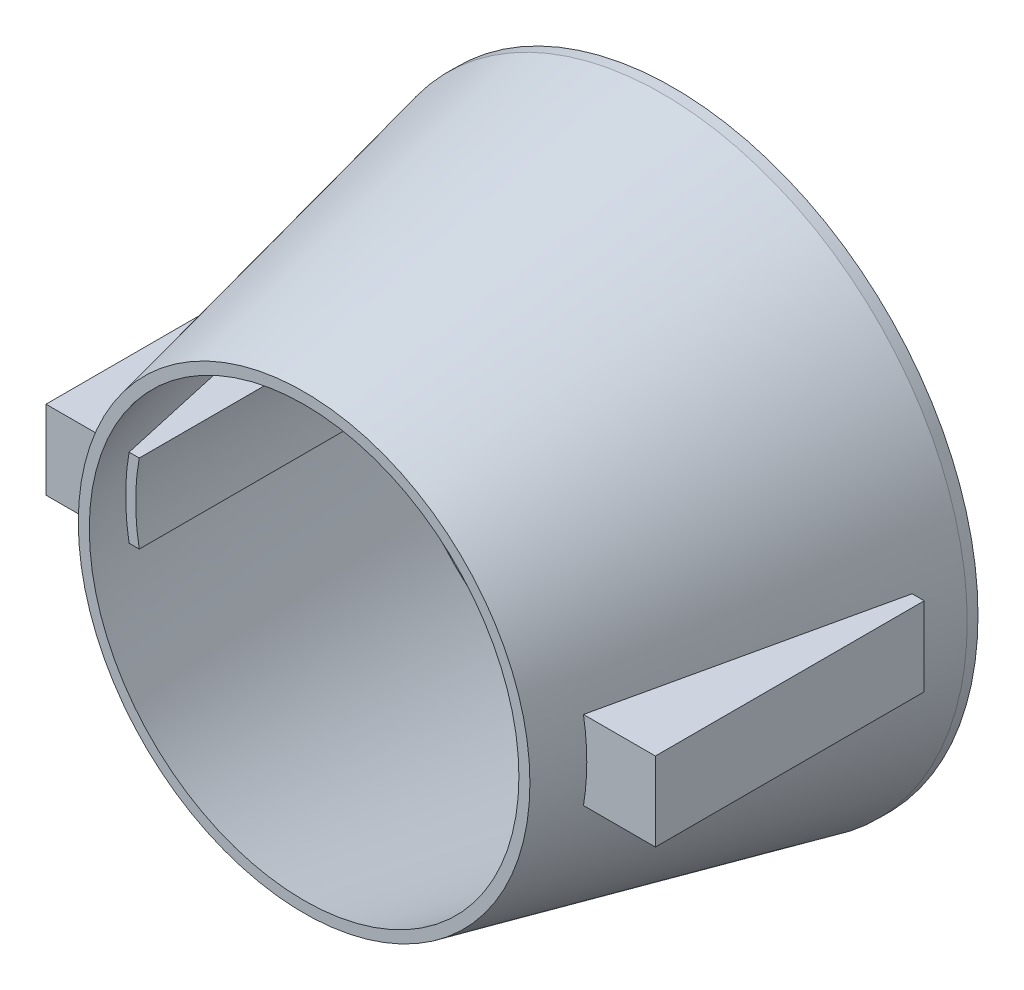
ISO-10303-21;
HEADER;
FILE_DESCRIPTION(('STEP AP214'),'2;1');
FILE_NAME('part.step','',(''),(''),'','','');
FILE_SCHEMA(('AUTOMOTIVE_DESIGN { 1 0 10303 214 1 1 1 1 }'));
ENDSEC;
DATA;
#1=APPLICATION_CONTEXT('core data for automotive mechanical design processes');
#2=APPLICATION_PROTOCOL_DEFINITION('international standard','automotive_design',2000,#1);
#3=PRODUCT_CONTEXT('',#1,'mechanical');
#4=PRODUCT('Part','Part','',(#3));
#5=PRODUCT_RELATED_PRODUCT_CATEGORY('part','',(#4));
#6=PRODUCT_DEFINITION_FORMATION('','',#4);
#7=PRODUCT_DEFINITION_CONTEXT('part definition',#1,'design');
#8=PRODUCT_DEFINITION('design','',#6,#7);
#9=PRODUCT_DEFINITION_SHAPE('','',#8);
#10=(LENGTH_UNIT() NAMED_UNIT(*) SI_UNIT(.MILLI.,.METRE.));
#11=(NAMED_UNIT(*) PLANE_ANGLE_UNIT() SI_UNIT($,.RADIAN.));
#12=(NAMED_UNIT(*) SI_UNIT($,.STERADIAN.) SOLID_ANGLE_UNIT());
#13=UNCERTAINTY_MEASURE_WITH_UNIT(LENGTH_MEASURE(1.E-05),#10,'distance_accuracy_value','');
#14=(GEOMETRIC_REPRESENTATION_CONTEXT(3) GLOBAL_UNCERTAINTY_ASSIGNED_CONTEXT((#13)) GLOBAL_UNIT_ASSIGNED_CONTEXT((#10,
#11,#12)) REPRESENTATION_CONTEXT('',''));
#15=CARTESIAN_POINT('',(0.,0.,0.));
#16=DIRECTION('',(0.,0.,1.));
#17=DIRECTION('',(1.,0.,0.));
#18=AXIS2_PLACEMENT_3D('',#15,#16,#17);
#19=CARTESIAN_POINT('',(0.,-11.,15.));
#20=DIRECTION('',(0.,0.,-1.));
#21=DIRECTION('',(0.,-1.,0.));
#22=AXIS2_PLACEMENT_3D('',#19,#20,#21);
#23=PLANE('',#22);
#24=CARTESIAN_POINT('',(0.,0.,15.));
#25=DIRECTION('',(0.,0.,1.));
#26=DIRECTION('',(-1.,0.,0.));
#27=AXIS2_PLACEMENT_3D('',#24,#25,#26);
#28=CIRCLE('',#27,60.);
#29=CARTESIAN_POINT('',(-58.9830484122345,11.,15.));
#30=VERTEX_POINT('',#29);
#31=CARTESIAN_POINT('',(-58.9830484122345,-11.,15.));
#32=VERTEX_POINT('',#31);
#33=EDGE_CURVE('E636',#30,#32,#28,.T.);
#34=ORIENTED_EDGE('',*,*,#33,.T.);
#35=DIRECTION('',(-1.,0.,0.));
#36=VECTOR('',#35,1.);
#37=CARTESIAN_POINT('',(0.,-11.,15.));
#38=LINE('',#37,#36);
#39=CARTESIAN_POINT('',(-78.5215118846876,-11.,15.));
#40=VERTEX_POINT('',#39);
#41=EDGE_CURVE('E639',#32,#40,#38,.T.);
#42=ORIENTED_EDGE('',*,*,#41,.T.);
#43=CARTESIAN_POINT('',(0.,0.,15.));
#44=DIRECTION('',(0.,0.,1.));
#45=DIRECTION('',(-1.,0.,0.));
#46=AXIS2_PLACEMENT_3D('',#43,#44,#45);
#47=CIRCLE('',#46,79.2882578233191);
#48=CARTESIAN_POINT('',(-78.5215118846876,11.,15.));
#49=VERTEX_POINT('',#48);
#50=EDGE_CURVE('E338',#49,#40,#47,.T.);
#51=ORIENTED_EDGE('',*,*,#50,.F.);
#52=DIRECTION('',(1.,0.,0.));
#53=VECTOR('',#52,1.);
#54=CARTESIAN_POINT('',(0.,11.,15.));
#55=LINE('',#54,#53);
#56=EDGE_CURVE('E11',#49,#30,#55,.T.);
#57=ORIENTED_EDGE('',*,*,#56,.T.);
#58=EDGE_LOOP('',(#34,#42,#51,#57));
#59=FACE_BOUND('',#58,.T.);
#60=ADVANCED_FACE('F17',(#59),#23,.T.);
#61=CARTESIAN_POINT('',(0.,11.,15.));
#62=DIRECTION('',(0.,1.,0.));
#63=DIRECTION('',(1.,0.,0.));
#64=AXIS2_PLACEMENT_3D('',#61,#62,#63);
#65=PLANE('',#64);
#66=DIRECTION('',(0.,0.,-1.));
#67=VECTOR('',#66,1.);
#68=CARTESIAN_POINT('',(-58.9830484122345,11.,90.));
#69=LINE('',#68,#67);
#70=CARTESIAN_POINT('',(-58.9830484122345,11.,90.));
#71=VERTEX_POINT('',#70);
#72=EDGE_CURVE('E644',#71,#30,#69,.T.);
#73=ORIENTED_EDGE('',*,*,#72,.T.);
#74=ORIENTED_EDGE('',*,*,#56,.F.);
#75=CARTESIAN_POINT('',(-61.8171927580637,11.,90.));
#76=CARTESIAN_POINT('',(-69.1993775707195,11.,56.9635723910746));
#77=CARTESIAN_POINT('',(-78.5215118846876,11.,15.));
#78=(BOUNDED_CURVE() B_SPLINE_CURVE(2,(#75,#76,#77),.UNSPECIFIED.,.F.,
.F.) B_SPLINE_CURVE_WITH_KNOTS((3,3),(0.,7.68377175610761),
.UNSPECIFIED.) CURVE() GEOMETRIC_REPRESENTATION_ITEM() RATIONAL_B_SPLINE_CURVE((1.,
1.00698416186936,1.)) REPRESENTATION_ITEM(''));
#79=CARTESIAN_POINT('',(-61.8171927580637,11.,90.));
#80=VERTEX_POINT('',#79);
#81=EDGE_CURVE('E332',#80,#49,#78,.T.);
#82=ORIENTED_EDGE('',*,*,#81,.F.);
#83=DIRECTION('',(1.,0.,0.));
#84=VECTOR('',#83,1.);
#85=CARTESIAN_POINT('',(0.,11.,90.));
#86=LINE('',#85,#84);
#87=EDGE_CURVE('E731',#80,#71,#86,.T.);
#88=ORIENTED_EDGE('',*,*,#87,.T.);
#89=EDGE_LOOP('',(#73,#74,#82,#88));
#90=FACE_BOUND('',#89,.T.);
#91=ADVANCED_FACE('F584',(#90),#65,.T.);
#92=CARTESIAN_POINT('',(0.,0.,0.));
#93=DIRECTION('',(0.,0.,1.));
#94=DIRECTION('',(1.,0.,0.));
#95=AXIS2_PLACEMENT_3D('',#92,#93,#94);
#96=PLANE('',#95);
#97=CARTESIAN_POINT('',(0.,0.,0.));
#98=DIRECTION('',(0.,0.,-1.));
#99=DIRECTION('',(1.,0.,0.));
#100=AXIS2_PLACEMENT_3D('',#97,#98,#99);
#101=CIRCLE('',#100,60.);
#102=CARTESIAN_POINT('',(-60.,0.,0.));
#103=VERTEX_POINT('',#102);
#104=EDGE_CURVE('E46',#103,#103,#101,.T.);
#105=ORIENTED_EDGE('',*,*,#104,.F.);
#106=EDGE_LOOP('',(#105));
#107=FACE_BOUND('',#106,.T.);
#108=CARTESIAN_POINT('',(0.,0.,0.));
#109=DIRECTION('',(0.,0.,1.));
#110=DIRECTION('',(1.,0.,0.));
#111=AXIS2_PLACEMENT_3D('',#108,#109,#110);
#112=CIRCLE('',#111,85.);
#113=CARTESIAN_POINT('',(-85.,0.,0.));
#114=VERTEX_POINT('',#113);
#115=EDGE_CURVE('E20',#114,#114,#112,.T.);
#116=ORIENTED_EDGE('',*,*,#115,.F.);
#117=EDGE_LOOP('',(#116));
#118=FACE_BOUND('',#117,.T.);
#119=ADVANCED_FACE('F519',(#107,#118),#96,.F.);
#120=CARTESIAN_POINT('',(0.,0.,0.));
#121=DIRECTION('',(0.,0.,1.));
#122=DIRECTION('',(1.,0.,0.));
#123=AXIS2_PLACEMENT_3D('',#120,#121,#122);
#124=CYLINDRICAL_SURFACE('',#123,85.);
#125=CARTESIAN_POINT('',(0.,0.,3.));
#126=DIRECTION('',(0.,0.,1.));
#127=DIRECTION('',(1.,0.,0.));
#128=AXIS2_PLACEMENT_3D('',#125,#126,#127);
#129=CIRCLE('',#128,85.);
#130=CARTESIAN_POINT('',(-85.,0.,3.));
#131=VERTEX_POINT('',#130);
#132=CARTESIAN_POINT('',(85.,0.,3.));
#133=VERTEX_POINT('',#132);
#134=EDGE_CURVE('E303',#131,#133,#129,.T.);
#135=ORIENTED_EDGE('',*,*,#134,.F.);
#136=DIRECTION('',(0.,0.,-1.));
#137=VECTOR('',#136,1.);
#138=CARTESIAN_POINT('',(-85.,0.,0.));
#139=LINE('',#138,#137);
#140=EDGE_CURVE('E361',#131,#114,#139,.T.);
#141=ORIENTED_EDGE('',*,*,#140,.T.);
#142=ORIENTED_EDGE('',*,*,#115,.T.);
#143=ORIENTED_EDGE('',*,*,#140,.F.);
#144=CARTESIAN_POINT('',(0.,0.,3.));
#145=DIRECTION('',(0.,0.,1.));
#146=DIRECTION('',(1.,0.,0.));
#147=AXIS2_PLACEMENT_3D('',#144,#145,#146);
#148=CIRCLE('',#147,85.);
#149=EDGE_CURVE('E307',#133,#131,#148,.T.);
#150=ORIENTED_EDGE('',*,*,#149,.F.);
#151=EDGE_LOOP('',(#135,#141,#142,#143,#150));
#152=FACE_BOUND('',#151,.T.);
#153=ADVANCED_FACE('F513',(#152),#124,.T.);
#154=CARTESIAN_POINT('',(0.,0.,0.));
#155=DIRECTION('',(0.,0.,1.));
#156=DIRECTION('',(1.,0.,0.));
#157=AXIS2_PLACEMENT_3D('',#154,#155,#156);
#158=CYLINDRICAL_SURFACE('',#157,60.);
#159=CARTESIAN_POINT('',(0.,0.,3.));
#160=DIRECTION('',(0.,0.,-1.));
#161=DIRECTION('',(1.,0.,0.));
#162=AXIS2_PLACEMENT_3D('',#159,#160,#161);
#163=CIRCLE('',#162,60.);
#164=CARTESIAN_POINT('',(-60.,0.,3.));
#165=VERTEX_POINT('',#164);
#166=EDGE_CURVE('E297',#165,#165,#163,.T.);
#167=ORIENTED_EDGE('',*,*,#166,.F.);
#168=DIRECTION('',(0.,0.,-1.));
#169=VECTOR('',#168,1.);
#170=CARTESIAN_POINT('',(-60.,0.,0.));
#171=LINE('',#170,#169);
#172=EDGE_CURVE('E306',#165,#103,#171,.T.);
#173=ORIENTED_EDGE('',*,*,#172,.T.);
#174=ORIENTED_EDGE('',*,*,#104,.T.);
#175=ORIENTED_EDGE('',*,*,#172,.F.);
#176=EDGE_LOOP('',(#167,#173,#174,#175));
#177=FACE_BOUND('',#176,.T.);
#178=ADVANCED_FACE('F518',(#177),#158,.F.);
#179=CARTESIAN_POINT('',(0.,0.,3.));
#180=DIRECTION('',(0.,0.,-1.));
#181=DIRECTION('',(-1.,0.,0.));
#182=AXIS2_PLACEMENT_3D('',#179,#180,#181);
#183=CONICAL_SURFACE('',#182,85.,0.216550304976089);
#184=CARTESIAN_POINT('',(-64.9348873872897,-11.,90.));
#185=CARTESIAN_POINT('',(-72.3496815282606,-11.,56.7698132026675));
#186=CARTESIAN_POINT('',(-81.6221146503814,-11.,15.));
#187=(BOUNDED_CURVE() B_SPLINE_CURVE(2,(#184,#185,#186),.UNSPECIFIED.,.F.,
.F.) B_SPLINE_CURVE_WITH_KNOTS((3,3),(0.,7.68340027985582),
.UNSPECIFIED.) CURVE() GEOMETRIC_REPRESENTATION_ITEM() RATIONAL_B_SPLINE_CURVE((1.,
1.00639849012095,1.)) REPRESENTATION_ITEM(''));
#188=CARTESIAN_POINT('',(-64.9348873872897,-11.,90.));
#189=VERTEX_POINT('',#188);
#190=CARTESIAN_POINT('',(-81.6221146503814,-11.,15.));
#191=VERTEX_POINT('',#190);
#192=EDGE_CURVE('E743',#189,#191,#187,.T.);
#193=ORIENTED_EDGE('',*,*,#192,.T.);
#194=CARTESIAN_POINT('',(0.,0.,15.));
#195=DIRECTION('',(0.,0.,-1.));
#196=DIRECTION('',(-1.,0.,0.));
#197=AXIS2_PLACEMENT_3D('',#194,#195,#196);
#198=CIRCLE('',#197,82.36);
#199=CARTESIAN_POINT('',(-81.6221146503814,11.,15.));
#200=VERTEX_POINT('',#199);
#201=EDGE_CURVE('E279',#191,#200,#198,.T.);
#202=ORIENTED_EDGE('',*,*,#201,.T.);
#203=CARTESIAN_POINT('',(-81.6221146503814,11.,15.));
#204=CARTESIAN_POINT('',(-72.3496815282606,11.,56.7698132026675));
#205=CARTESIAN_POINT('',(-64.9348873872897,11.,90.));
#206=(BOUNDED_CURVE() B_SPLINE_CURVE(2,(#203,#204,#205),.UNSPECIFIED.,.F.,
.F.) B_SPLINE_CURVE_WITH_KNOTS((3,3),(0.,7.68340027985582),
.UNSPECIFIED.) CURVE() GEOMETRIC_REPRESENTATION_ITEM() RATIONAL_B_SPLINE_CURVE((1.,
1.00639849012095,1.)) REPRESENTATION_ITEM(''));
#207=CARTESIAN_POINT('',(-64.9348873872897,11.,90.));
#208=VERTEX_POINT('',#207);
#209=EDGE_CURVE('E302',#200,#208,#206,.T.);
#210=ORIENTED_EDGE('',*,*,#209,.T.);
#211=CARTESIAN_POINT('',(0.,0.,90.));
#212=DIRECTION('',(0.,0.,1.));
#213=DIRECTION('',(-1.,0.,0.));
#214=AXIS2_PLACEMENT_3D('',#211,#212,#213);
#215=CIRCLE('',#214,65.86);
#216=EDGE_CURVE('E270',#208,#189,#215,.T.);
#217=ORIENTED_EDGE('',*,*,#216,.T.);
#218=EDGE_LOOP('',(#193,#202,#210,#217));
#219=FACE_BOUND('',#218,.T.);
#220=CARTESIAN_POINT('',(0.,0.,103.));
#221=DIRECTION('',(0.,0.,-1.));
#222=DIRECTION('',(1.,0.,0.));
#223=AXIS2_PLACEMENT_3D('',#220,#221,#222);
#224=CIRCLE('',#223,63.);
#225=CARTESIAN_POINT('',(63.,0.,103.));
#226=VERTEX_POINT('',#225);
#227=EDGE_CURVE('E346',#226,#226,#224,.T.);
#228=ORIENTED_EDGE('',*,*,#227,.T.);
#229=DIRECTION('',(0.21486178267512,0.,-0.97664446670509));
#230=VECTOR('',#229,1.);
#231=CARTESIAN_POINT('',(85.,0.,3.));
#232=LINE('',#231,#230);
#233=CARTESIAN_POINT('',(65.86,0.,90.));
#234=VERTEX_POINT('',#233);
#235=EDGE_CURVE('E350',#226,#234,#232,.T.);
#236=ORIENTED_EDGE('',*,*,#235,.T.);
#237=CARTESIAN_POINT('',(0.,0.,90.));
#238=DIRECTION('',(0.,0.,1.));
#239=DIRECTION('',(-1.,0.,0.));
#240=AXIS2_PLACEMENT_3D('',#237,#238,#239);
#241=CIRCLE('',#240,65.86);
#242=CARTESIAN_POINT('',(64.9348873872897,11.,90.));
#243=VERTEX_POINT('',#242);
#244=EDGE_CURVE('E266',#234,#243,#241,.T.);
#245=ORIENTED_EDGE('',*,*,#244,.T.);
#246=CARTESIAN_POINT('',(64.9348873872897,11.,90.));
#247=CARTESIAN_POINT('',(72.3496815282606,11.,56.7698132026675));
#248=CARTESIAN_POINT('',(81.6221146503814,11.,15.));
#249=(BOUNDED_CURVE() B_SPLINE_CURVE(2,(#246,#247,#248),.UNSPECIFIED.,.F.,
.F.) B_SPLINE_CURVE_WITH_KNOTS((3,3),(0.,7.68340027985582),
.UNSPECIFIED.) CURVE() GEOMETRIC_REPRESENTATION_ITEM() RATIONAL_B_SPLINE_CURVE((1.,
1.00639849012095,1.)) REPRESENTATION_ITEM(''));
#250=CARTESIAN_POINT('',(81.6221146503814,11.,15.));
#251=VERTEX_POINT('',#250);
#252=EDGE_CURVE('E317',#243,#251,#249,.T.);
#253=ORIENTED_EDGE('',*,*,#252,.T.);
#254=CARTESIAN_POINT('',(0.,0.,15.));
#255=DIRECTION('',(0.,0.,-1.));
#256=DIRECTION('',(-1.,0.,0.));
#257=AXIS2_PLACEMENT_3D('',#254,#255,#256);
#258=CIRCLE('',#257,82.36);
#259=CARTESIAN_POINT('',(82.36,0.,15.));
#260=VERTEX_POINT('',#259);
#261=EDGE_CURVE('E288',#251,#260,#258,.T.);
#262=ORIENTED_EDGE('',*,*,#261,.T.);
#263=DIRECTION('',(0.21486178267512,0.,-0.97664446670509));
#264=VECTOR('',#263,1.);
#265=CARTESIAN_POINT('',(85.,0.,3.));
#266=LINE('',#265,#264);
#267=EDGE_CURVE('E353',#260,#133,#266,.T.);
#268=ORIENTED_EDGE('',*,*,#267,.T.);
#269=ORIENTED_EDGE('',*,*,#149,.T.);
#270=ORIENTED_EDGE('',*,*,#134,.T.);
#271=ORIENTED_EDGE('',*,*,#267,.F.);
#272=CARTESIAN_POINT('',(0.,0.,15.));
#273=DIRECTION('',(0.,0.,-1.));
#274=DIRECTION('',(-1.,0.,0.));
#275=AXIS2_PLACEMENT_3D('',#272,#273,#274);
#276=CIRCLE('',#275,82.36);
#277=CARTESIAN_POINT('',(81.6221146503814,-11.,15.));
#278=VERTEX_POINT('',#277);
#279=EDGE_CURVE('E228',#260,#278,#276,.T.);
#280=ORIENTED_EDGE('',*,*,#279,.T.);
#281=CARTESIAN_POINT('',(81.6221146503814,-11.,15.));
#282=CARTESIAN_POINT('',(72.3496815282606,-11.,56.7698132026675));
#283=CARTESIAN_POINT('',(64.9348873872897,-11.,90.));
#284=(BOUNDED_CURVE() B_SPLINE_CURVE(2,(#281,#282,#283),.UNSPECIFIED.,.F.,
.F.) B_SPLINE_CURVE_WITH_KNOTS((3,3),(0.,7.68340027985582),
.UNSPECIFIED.) CURVE() GEOMETRIC_REPRESENTATION_ITEM() RATIONAL_B_SPLINE_CURVE((1.,
1.00639849012095,1.)) REPRESENTATION_ITEM(''));
#285=CARTESIAN_POINT('',(64.9348873872897,-11.,90.));
#286=VERTEX_POINT('',#285);
#287=EDGE_CURVE('E243',#278,#286,#284,.T.);
#288=ORIENTED_EDGE('',*,*,#287,.T.);
#289=CARTESIAN_POINT('',(0.,0.,90.));
#290=DIRECTION('',(0.,0.,1.));
#291=DIRECTION('',(-1.,0.,0.));
#292=AXIS2_PLACEMENT_3D('',#289,#290,#291);
#293=CIRCLE('',#292,65.86);
#294=EDGE_CURVE('E256',#286,#234,#293,.T.);
#295=ORIENTED_EDGE('',*,*,#294,.T.);
#296=ORIENTED_EDGE('',*,*,#235,.F.);
#297=EDGE_LOOP('',(#228,#236,#245,#253,#262,#268,#269,#270,#271,#280,#288,#295,#296));
#298=FACE_BOUND('',#297,.T.);
#299=ADVANCED_FACE('F562',(#219,#298),#183,.T.);
#300=CARTESIAN_POINT('',(0.,0.,103.));
#301=DIRECTION('',(0.,0.,-1.));
#302=DIRECTION('',(0.,-1.,0.));
#303=AXIS2_PLACEMENT_3D('',#300,#301,#302);
#304=PLANE('',#303);
#305=CARTESIAN_POINT('',(0.,0.,103.));
#306=DIRECTION('',(0.,0.,-1.));
#307=DIRECTION('',(-1.,0.,0.));
#308=AXIS2_PLACEMENT_3D('',#305,#306,#307);
#309=CIRCLE('',#308,59.9282578233191);
#310=CARTESIAN_POINT('',(59.9282578233191,0.,103.));
#311=VERTEX_POINT('',#310);
#312=EDGE_CURVE('E331',#311,#311,#309,.T.);
#313=ORIENTED_EDGE('',*,*,#312,.T.);
#314=EDGE_LOOP('',(#313));
#315=FACE_BOUND('',#314,.T.);
#316=ORIENTED_EDGE('',*,*,#227,.F.);
#317=EDGE_LOOP('',(#316));
#318=FACE_BOUND('',#317,.T.);
#319=ADVANCED_FACE('F553',(#315,#318),#304,.F.);
#320=CARTESIAN_POINT('',(0.,0.,2.35541465197464));
#321=DIRECTION('',(0.,0.,-1.));
#322=DIRECTION('',(-1.,0.,0.));
#323=AXIS2_PLACEMENT_3D('',#320,#321,#322);
#324=CONICAL_SURFACE('',#323,82.0700665998847,0.216550304976089);
#325=CARTESIAN_POINT('',(-78.5215118846876,-11.,15.));
#326=CARTESIAN_POINT('',(-69.1993775707195,-11.,56.9635723910746));
#327=CARTESIAN_POINT('',(-61.8171927580637,-11.,90.));
#328=(BOUNDED_CURVE() B_SPLINE_CURVE(2,(#325,#326,#327),.UNSPECIFIED.,.F.,
.F.) B_SPLINE_CURVE_WITH_KNOTS((3,3),(0.,7.68377175610761),
.UNSPECIFIED.) CURVE() GEOMETRIC_REPRESENTATION_ITEM() RATIONAL_B_SPLINE_CURVE((1.,
1.00698416186936,1.)) REPRESENTATION_ITEM(''));
#329=CARTESIAN_POINT('',(-61.8171927580637,-11.,90.));
#330=VERTEX_POINT('',#329);
#331=EDGE_CURVE('E713',#40,#330,#328,.T.);
#332=ORIENTED_EDGE('',*,*,#331,.T.);
#333=CARTESIAN_POINT('',(0.,0.,90.));
#334=DIRECTION('',(0.,0.,-1.));
#335=DIRECTION('',(-1.,0.,0.));
#336=AXIS2_PLACEMENT_3D('',#333,#334,#335);
#337=CIRCLE('',#336,62.7882578233191);
#338=EDGE_CURVE('E734',#330,#80,#337,.T.);
#339=ORIENTED_EDGE('',*,*,#338,.T.);
#340=ORIENTED_EDGE('',*,*,#81,.T.);
#341=ORIENTED_EDGE('',*,*,#50,.T.);
#342=EDGE_LOOP('',(#332,#339,#340,#341));
#343=FACE_BOUND('',#342,.T.);
#344=CARTESIAN_POINT('',(0.,0.,3.));
#345=DIRECTION('',(0.,0.,1.));
#346=DIRECTION('',(-1.,0.,0.));
#347=AXIS2_PLACEMENT_3D('',#344,#345,#346);
#348=CIRCLE('',#347,81.9282578233191);
#349=CARTESIAN_POINT('',(81.9282578233191,0.,3.));
#350=VERTEX_POINT('',#349);
#351=EDGE_CURVE('E294',#350,#350,#348,.T.);
#352=ORIENTED_EDGE('',*,*,#351,.F.);
#353=DIRECTION('',(-0.21486178267512,0.,0.97664446670509));
#354=VECTOR('',#353,1.);
#355=CARTESIAN_POINT('',(82.0700665998847,0.,2.35541465197464));
#356=LINE('',#355,#354);
#357=CARTESIAN_POINT('',(79.2882578233191,0.,15.));
#358=VERTEX_POINT('',#357);
#359=EDGE_CURVE('E324',#350,#358,#356,.T.);
#360=ORIENTED_EDGE('',*,*,#359,.T.);
#361=CARTESIAN_POINT('',(0.,0.,15.));
#362=DIRECTION('',(0.,0.,1.));
#363=DIRECTION('',(-1.,0.,0.));
#364=AXIS2_PLACEMENT_3D('',#361,#362,#363);
#365=CIRCLE('',#364,79.2882578233191);
#366=CARTESIAN_POINT('',(78.5215118846876,11.,15.));
#367=VERTEX_POINT('',#366);
#368=EDGE_CURVE('E669',#358,#367,#365,.T.);
#369=ORIENTED_EDGE('',*,*,#368,.T.);
#370=CARTESIAN_POINT('',(78.5215118846876,11.,15.));
#371=CARTESIAN_POINT('',(69.1993775707195,11.,56.9635723910746));
#372=CARTESIAN_POINT('',(61.8171927580637,11.,90.));
#373=(BOUNDED_CURVE() B_SPLINE_CURVE(2,(#370,#371,#372),.UNSPECIFIED.,.F.,
.F.) B_SPLINE_CURVE_WITH_KNOTS((3,3),(0.,7.68377175610761),
.UNSPECIFIED.) CURVE() GEOMETRIC_REPRESENTATION_ITEM() RATIONAL_B_SPLINE_CURVE((1.,
1.00698416186936,1.)) REPRESENTATION_ITEM(''));
#374=CARTESIAN_POINT('',(61.8171927580637,11.,90.));
#375=VERTEX_POINT('',#374);
#376=EDGE_CURVE('E738',#367,#375,#373,.T.);
#377=ORIENTED_EDGE('',*,*,#376,.T.);
#378=CARTESIAN_POINT('',(0.,0.,90.));
#379=DIRECTION('',(0.,0.,-1.));
#380=DIRECTION('',(-1.,0.,0.));
#381=AXIS2_PLACEMENT_3D('',#378,#379,#380);
#382=CIRCLE('',#381,62.7882578233191);
#383=CARTESIAN_POINT('',(62.7882578233191,0.,90.));
#384=VERTEX_POINT('',#383);
#385=EDGE_CURVE('E719',#375,#384,#382,.T.);
#386=ORIENTED_EDGE('',*,*,#385,.T.);
#387=DIRECTION('',(-0.21486178267512,0.,0.97664446670509));
#388=VECTOR('',#387,1.);
#389=CARTESIAN_POINT('',(82.0700665998847,0.,2.35541465197464));
#390=LINE('',#389,#388);
#391=EDGE_CURVE('E327',#384,#311,#390,.T.);
#392=ORIENTED_EDGE('',*,*,#391,.T.);
#393=ORIENTED_EDGE('',*,*,#312,.F.);
#394=ORIENTED_EDGE('',*,*,#391,.F.);
#395=CARTESIAN_POINT('',(0.,0.,90.));
#396=DIRECTION('',(0.,0.,-1.));
#397=DIRECTION('',(-1.,0.,0.));
#398=AXIS2_PLACEMENT_3D('',#395,#396,#397);
#399=CIRCLE('',#398,62.7882578233191);
#400=CARTESIAN_POINT('',(61.8171927580637,-11.,90.));
#401=VERTEX_POINT('',#400);
#402=EDGE_CURVE('E716',#384,#401,#399,.T.);
#403=ORIENTED_EDGE('',*,*,#402,.T.);
#404=CARTESIAN_POINT('',(61.8171927580637,-11.,90.));
#405=CARTESIAN_POINT('',(69.1993775707195,-11.,56.9635723910746));
#406=CARTESIAN_POINT('',(78.5215118846876,-11.,15.));
#407=(BOUNDED_CURVE() B_SPLINE_CURVE(2,(#404,#405,#406),.UNSPECIFIED.,.F.,
.F.) B_SPLINE_CURVE_WITH_KNOTS((3,3),(0.,7.68377175610761),
.UNSPECIFIED.) CURVE() GEOMETRIC_REPRESENTATION_ITEM() RATIONAL_B_SPLINE_CURVE((1.,
1.00698416186936,1.)) REPRESENTATION_ITEM(''));
#408=CARTESIAN_POINT('',(78.5215118846876,-11.,15.));
#409=VERTEX_POINT('',#408);
#410=EDGE_CURVE('E685',#401,#409,#407,.T.);
#411=ORIENTED_EDGE('',*,*,#410,.T.);
#412=CARTESIAN_POINT('',(0.,0.,15.));
#413=DIRECTION('',(0.,0.,1.));
#414=DIRECTION('',(-1.,0.,0.));
#415=AXIS2_PLACEMENT_3D('',#412,#413,#414);
#416=CIRCLE('',#415,79.2882578233191);
#417=EDGE_CURVE('E677',#409,#358,#416,.T.);
#418=ORIENTED_EDGE('',*,*,#417,.T.);
#419=ORIENTED_EDGE('',*,*,#359,.F.);
#420=EDGE_LOOP('',(#352,#360,#369,#377,#386,#392,#393,#394,#403,#411,#418,#419));
#421=FACE_BOUND('',#420,.T.);
#422=ADVANCED_FACE('F544',(#343,#421),#324,.F.);
#423=CARTESIAN_POINT('',(0.,0.,3.));
#424=DIRECTION('',(0.,0.,1.));
#425=DIRECTION('',(1.,0.,0.));
#426=AXIS2_PLACEMENT_3D('',#423,#424,#425);
#427=PLANE('',#426);
#428=ORIENTED_EDGE('',*,*,#166,.T.);
#429=EDGE_LOOP('',(#428));
#430=FACE_BOUND('',#429,.T.);
#431=ORIENTED_EDGE('',*,*,#351,.T.);
#432=EDGE_LOOP('',(#431));
#433=FACE_BOUND('',#432,.T.);
#434=ADVANCED_FACE('F536',(#430,#433),#427,.T.);
#435=CARTESIAN_POINT('',(85.,0.,52.5));
#436=DIRECTION('',(1.,0.,0.));
#437=DIRECTION('',(0.,1.,0.));
#438=AXIS2_PLACEMENT_3D('',#435,#436,#437);
#439=PLANE('',#438);
#440=DIRECTION('',(0.,1.,0.));
#441=VECTOR('',#440,1.);
#442=CARTESIAN_POINT('',(85.,11.,15.));
#443=LINE('',#442,#441);
#444=CARTESIAN_POINT('',(85.,-11.,15.));
#445=VERTEX_POINT('',#444);
#446=CARTESIAN_POINT('',(85.,11.,15.));
#447=VERTEX_POINT('',#446);
#448=EDGE_CURVE('E216',#445,#447,#443,.T.);
#449=ORIENTED_EDGE('',*,*,#448,.T.);
#450=DIRECTION('',(0.,0.,1.));
#451=VECTOR('',#450,1.);
#452=CARTESIAN_POINT('',(85.,11.,90.));
#453=LINE('',#452,#451);
#454=CARTESIAN_POINT('',(85.,11.,90.));
#455=VERTEX_POINT('',#454);
#456=EDGE_CURVE('E298',#447,#455,#453,.T.);
#457=ORIENTED_EDGE('',*,*,#456,.T.);
#458=DIRECTION('',(0.,-1.,0.));
#459=VECTOR('',#458,1.);
#460=CARTESIAN_POINT('',(85.,-11.,90.));
#461=LINE('',#460,#459);
#462=CARTESIAN_POINT('',(85.,-11.,90.));
#463=VERTEX_POINT('',#462);
#464=EDGE_CURVE('E234',#455,#463,#461,.T.);
#465=ORIENTED_EDGE('',*,*,#464,.T.);
#466=DIRECTION('',(0.,0.,-1.));
#467=VECTOR('',#466,1.);
#468=CARTESIAN_POINT('',(85.,-11.,15.));
#469=LINE('',#468,#467);
#470=EDGE_CURVE('E231',#463,#445,#469,.T.);
#471=ORIENTED_EDGE('',*,*,#470,.T.);
#472=EDGE_LOOP('',(#449,#457,#465,#471));
#473=FACE_BOUND('',#472,.T.);
#474=ADVANCED_FACE('F232',(#473),#439,.T.);
#475=CARTESIAN_POINT('',(-85.,0.,52.5));
#476=DIRECTION('',(-1.,0.,0.));
#477=DIRECTION('',(0.,0.,1.));
#478=AXIS2_PLACEMENT_3D('',#475,#476,#477);
#479=PLANE('',#478);
#480=DIRECTION('',(0.,-1.,0.));
#481=VECTOR('',#480,1.);
#482=CARTESIAN_POINT('',(-85.,11.,15.));
#483=LINE('',#482,#481);
#484=CARTESIAN_POINT('',(-85.,11.,15.));
#485=VERTEX_POINT('',#484);
#486=CARTESIAN_POINT('',(-85.,-11.,15.));
#487=VERTEX_POINT('',#486);
#488=EDGE_CURVE('E283',#485,#487,#483,.T.);
#489=ORIENTED_EDGE('',*,*,#488,.T.);
#490=DIRECTION('',(0.,0.,1.));
#491=VECTOR('',#490,1.);
#492=CARTESIAN_POINT('',(-85.,-11.,15.));
#493=LINE('',#492,#491);
#494=CARTESIAN_POINT('',(-85.,-11.,90.));
#495=VERTEX_POINT('',#494);
#496=EDGE_CURVE('E758',#487,#495,#493,.T.);
#497=ORIENTED_EDGE('',*,*,#496,.T.);
#498=DIRECTION('',(0.,1.,0.));
#499=VECTOR('',#498,1.);
#500=CARTESIAN_POINT('',(-85.,-11.,90.));
#501=LINE('',#500,#499);
#502=CARTESIAN_POINT('',(-85.,11.,90.));
#503=VERTEX_POINT('',#502);
#504=EDGE_CURVE('E275',#495,#503,#501,.T.);
#505=ORIENTED_EDGE('',*,*,#504,.T.);
#506=DIRECTION('',(0.,0.,-1.));
#507=VECTOR('',#506,1.);
#508=CARTESIAN_POINT('',(-85.,11.,90.));
#509=LINE('',#508,#507);
#510=EDGE_CURVE('E312',#503,#485,#509,.T.);
#511=ORIENTED_EDGE('',*,*,#510,.T.);
#512=EDGE_LOOP('',(#489,#497,#505,#511));
#513=FACE_BOUND('',#512,.T.);
#514=ADVANCED_FACE('F488',(#513),#479,.T.);
#515=CARTESIAN_POINT('',(0.,11.,15.));
#516=DIRECTION('',(0.,1.,0.));
#517=DIRECTION('',(1.,0.,0.));
#518=AXIS2_PLACEMENT_3D('',#515,#516,#517);
#519=PLANE('',#518);
#520=ORIENTED_EDGE('',*,*,#252,.F.);
#521=DIRECTION('',(-1.,0.,0.));
#522=VECTOR('',#521,1.);
#523=CARTESIAN_POINT('',(0.,11.,90.));
#524=LINE('',#523,#522);
#525=EDGE_CURVE('E262',#455,#243,#524,.T.);
#526=ORIENTED_EDGE('',*,*,#525,.F.);
#527=ORIENTED_EDGE('',*,*,#456,.F.);
#528=DIRECTION('',(1.,0.,0.));
#529=VECTOR('',#528,1.);
#530=CARTESIAN_POINT('',(0.,11.,15.));
#531=LINE('',#530,#529);
#532=EDGE_CURVE('E225',#251,#447,#531,.T.);
#533=ORIENTED_EDGE('',*,*,#532,.F.);
#534=EDGE_LOOP('',(#520,#526,#527,#533));
#535=FACE_BOUND('',#534,.T.);
#536=ADVANCED_FACE('F375',(#535),#519,.T.);
#537=CARTESIAN_POINT('',(0.,11.,15.));
#538=DIRECTION('',(0.,1.,0.));
#539=DIRECTION('',(1.,0.,0.));
#540=AXIS2_PLACEMENT_3D('',#537,#538,#539);
#541=PLANE('',#540);
#542=ORIENTED_EDGE('',*,*,#209,.F.);
#543=DIRECTION('',(1.,0.,0.));
#544=VECTOR('',#543,1.);
#545=CARTESIAN_POINT('',(0.,11.,15.));
#546=LINE('',#545,#544);
#547=EDGE_CURVE('E284',#485,#200,#546,.T.);
#548=ORIENTED_EDGE('',*,*,#547,.F.);
#549=ORIENTED_EDGE('',*,*,#510,.F.);
#550=DIRECTION('',(-1.,0.,0.));
#551=VECTOR('',#550,1.);
#552=CARTESIAN_POINT('',(0.,11.,90.));
#553=LINE('',#552,#551);
#554=EDGE_CURVE('E271',#208,#503,#553,.T.);
#555=ORIENTED_EDGE('',*,*,#554,.F.);
#556=EDGE_LOOP('',(#542,#548,#549,#555));
#557=FACE_BOUND('',#556,.T.);
#558=ADVANCED_FACE('F370',(#557),#541,.T.);
#559=CARTESIAN_POINT('',(0.,-11.,15.));
#560=DIRECTION('',(0.,0.,-1.));
#561=DIRECTION('',(0.,-1.,0.));
#562=AXIS2_PLACEMENT_3D('',#559,#560,#561);
#563=PLANE('',#562);
#564=ORIENTED_EDGE('',*,*,#261,.F.);
#565=ORIENTED_EDGE('',*,*,#532,.T.);
#566=ORIENTED_EDGE('',*,*,#448,.F.);
#567=DIRECTION('',(-1.,0.,0.));
#568=VECTOR('',#567,1.);
#569=CARTESIAN_POINT('',(0.,-11.,15.));
#570=LINE('',#569,#568);
#571=EDGE_CURVE('E222',#445,#278,#570,.T.);
#572=ORIENTED_EDGE('',*,*,#571,.T.);
#573=ORIENTED_EDGE('',*,*,#279,.F.);
#574=EDGE_LOOP('',(#564,#565,#566,#572,#573));
#575=FACE_BOUND('',#574,.T.);
#576=ADVANCED_FACE('F219',(#575),#563,.T.);
#577=CARTESIAN_POINT('',(0.,-11.,15.));
#578=DIRECTION('',(0.,0.,-1.));
#579=DIRECTION('',(0.,-1.,0.));
#580=AXIS2_PLACEMENT_3D('',#577,#578,#579);
#581=PLANE('',#580);
#582=ORIENTED_EDGE('',*,*,#201,.F.);
#583=DIRECTION('',(-1.,0.,0.));
#584=VECTOR('',#583,1.);
#585=CARTESIAN_POINT('',(0.,-11.,15.));
#586=LINE('',#585,#584);
#587=EDGE_CURVE('E249',#191,#487,#586,.T.);
#588=ORIENTED_EDGE('',*,*,#587,.T.);
#589=ORIENTED_EDGE('',*,*,#488,.F.);
#590=ORIENTED_EDGE('',*,*,#547,.T.);
#591=EDGE_LOOP('',(#582,#588,#589,#590));
#592=FACE_BOUND('',#591,.T.);
#593=ADVANCED_FACE('F383',(#592),#581,.T.);
#594=CARTESIAN_POINT('',(0.,11.,90.));
#595=DIRECTION('',(0.,0.,1.));
#596=DIRECTION('',(1.,0.,0.));
#597=AXIS2_PLACEMENT_3D('',#594,#595,#596);
#598=PLANE('',#597);
#599=ORIENTED_EDGE('',*,*,#216,.F.);
#600=ORIENTED_EDGE('',*,*,#554,.T.);
#601=ORIENTED_EDGE('',*,*,#504,.F.);
#602=DIRECTION('',(-1.,0.,0.));
#603=VECTOR('',#602,1.);
#604=CARTESIAN_POINT('',(0.,-11.,90.));
#605=LINE('',#604,#603);
#606=EDGE_CURVE('E752',#189,#495,#605,.T.);
#607=ORIENTED_EDGE('',*,*,#606,.F.);
#608=EDGE_LOOP('',(#599,#600,#601,#607));
#609=FACE_BOUND('',#608,.T.);
#610=ADVANCED_FACE('F388',(#609),#598,.T.);
#611=CARTESIAN_POINT('',(0.,11.,90.));
#612=DIRECTION('',(0.,0.,1.));
#613=DIRECTION('',(1.,0.,0.));
#614=AXIS2_PLACEMENT_3D('',#611,#612,#613);
#615=PLANE('',#614);
#616=ORIENTED_EDGE('',*,*,#294,.F.);
#617=DIRECTION('',(-1.,0.,0.));
#618=VECTOR('',#617,1.);
#619=CARTESIAN_POINT('',(0.,-11.,90.));
#620=LINE('',#619,#618);
#621=EDGE_CURVE('E239',#463,#286,#620,.T.);
#622=ORIENTED_EDGE('',*,*,#621,.F.);
#623=ORIENTED_EDGE('',*,*,#464,.F.);
#624=ORIENTED_EDGE('',*,*,#525,.T.);
#625=ORIENTED_EDGE('',*,*,#244,.F.);
#626=EDGE_LOOP('',(#616,#622,#623,#624,#625));
#627=FACE_BOUND('',#626,.T.);
#628=ADVANCED_FACE('F417',(#627),#615,.T.);
#629=CARTESIAN_POINT('',(0.,-11.,90.));
#630=DIRECTION('',(0.,-1.,0.));
#631=DIRECTION('',(0.,0.,-1.));
#632=AXIS2_PLACEMENT_3D('',#629,#630,#631);
#633=PLANE('',#632);
#634=ORIENTED_EDGE('',*,*,#287,.F.);
#635=ORIENTED_EDGE('',*,*,#571,.F.);
#636=ORIENTED_EDGE('',*,*,#470,.F.);
#637=ORIENTED_EDGE('',*,*,#621,.T.);
#638=EDGE_LOOP('',(#634,#635,#636,#637));
#639=FACE_BOUND('',#638,.T.);
#640=ADVANCED_FACE('F241',(#639),#633,.T.);
#641=CARTESIAN_POINT('',(0.,-11.,90.));
#642=DIRECTION('',(0.,-1.,0.));
#643=DIRECTION('',(0.,0.,-1.));
#644=AXIS2_PLACEMENT_3D('',#641,#642,#643);
#645=PLANE('',#644);
#646=ORIENTED_EDGE('',*,*,#192,.F.);
#647=ORIENTED_EDGE('',*,*,#606,.T.);
#648=ORIENTED_EDGE('',*,*,#496,.F.);
#649=ORIENTED_EDGE('',*,*,#587,.F.);
#650=EDGE_LOOP('',(#646,#647,#648,#649));
#651=FACE_BOUND('',#650,.T.);
#652=ADVANCED_FACE('F423',(#651),#645,.T.);
#653=CARTESIAN_POINT('',(0.,11.,15.));
#654=DIRECTION('',(0.,1.,0.));
#655=DIRECTION('',(1.,0.,0.));
#656=AXIS2_PLACEMENT_3D('',#653,#654,#655);
#657=PLANE('',#656);
#658=DIRECTION('',(0.,0.,1.));
#659=VECTOR('',#658,1.);
#660=CARTESIAN_POINT('',(58.9830484122345,11.,90.));
#661=LINE('',#660,#659);
#662=CARTESIAN_POINT('',(58.9830484122345,11.,15.));
#663=VERTEX_POINT('',#662);
#664=CARTESIAN_POINT('',(58.9830484122345,11.,90.));
#665=VERTEX_POINT('',#664);
#666=EDGE_CURVE('E659',#663,#665,#661,.T.);
#667=ORIENTED_EDGE('',*,*,#666,.T.);
#668=DIRECTION('',(1.,0.,0.));
#669=VECTOR('',#668,1.);
#670=CARTESIAN_POINT('',(0.,11.,90.));
#671=LINE('',#670,#669);
#672=EDGE_CURVE('E725',#665,#375,#671,.T.);
#673=ORIENTED_EDGE('',*,*,#672,.T.);
#674=ORIENTED_EDGE('',*,*,#376,.F.);
#675=DIRECTION('',(1.,0.,0.));
#676=VECTOR('',#675,1.);
#677=CARTESIAN_POINT('',(0.,11.,15.));
#678=LINE('',#677,#676);
#679=EDGE_CURVE('E665',#663,#367,#678,.T.);
#680=ORIENTED_EDGE('',*,*,#679,.F.);
#681=EDGE_LOOP('',(#667,#673,#674,#680));
#682=FACE_BOUND('',#681,.T.);
#683=ADVANCED_FACE('F428',(#682),#657,.T.);
#684=CARTESIAN_POINT('',(0.,11.,90.));
#685=DIRECTION('',(0.,0.,1.));
#686=DIRECTION('',(1.,0.,0.));
#687=AXIS2_PLACEMENT_3D('',#684,#685,#686);
#688=PLANE('',#687);
#689=CARTESIAN_POINT('',(0.,0.,90.));
#690=DIRECTION('',(0.,0.,-1.));
#691=DIRECTION('',(-1.,0.,0.));
#692=AXIS2_PLACEMENT_3D('',#689,#690,#691);
#693=CIRCLE('',#692,60.);
#694=CARTESIAN_POINT('',(-58.9830484122345,-11.,90.));
#695=VERTEX_POINT('',#694);
#696=EDGE_CURVE('E650',#695,#71,#693,.T.);
#697=ORIENTED_EDGE('',*,*,#696,.T.);
#698=ORIENTED_EDGE('',*,*,#87,.F.);
#699=ORIENTED_EDGE('',*,*,#338,.F.);
#700=DIRECTION('',(1.,0.,0.));
#701=VECTOR('',#700,1.);
#702=CARTESIAN_POINT('',(0.,-11.,90.));
#703=LINE('',#702,#701);
#704=EDGE_CURVE('E696',#330,#695,#703,.T.);
#705=ORIENTED_EDGE('',*,*,#704,.T.);
#706=EDGE_LOOP('',(#697,#698,#699,#705));
#707=FACE_BOUND('',#706,.T.);
#708=ADVANCED_FACE('F462',(#707),#688,.T.);
#709=CARTESIAN_POINT('',(0.,11.,90.));
#710=DIRECTION('',(0.,0.,1.));
#711=DIRECTION('',(1.,0.,0.));
#712=AXIS2_PLACEMENT_3D('',#709,#710,#711);
#713=PLANE('',#712);
#714=CARTESIAN_POINT('',(0.,0.,90.));
#715=DIRECTION('',(0.,0.,-1.));
#716=DIRECTION('',(-1.,0.,0.));
#717=AXIS2_PLACEMENT_3D('',#714,#715,#716);
#718=CIRCLE('',#717,60.);
#719=CARTESIAN_POINT('',(58.9830484122345,-11.,90.));
#720=VERTEX_POINT('',#719);
#721=EDGE_CURVE('E662',#665,#720,#718,.T.);
#722=ORIENTED_EDGE('',*,*,#721,.T.);
#723=DIRECTION('',(1.,0.,0.));
#724=VECTOR('',#723,1.);
#725=CARTESIAN_POINT('',(0.,-11.,90.));
#726=LINE('',#725,#724);
#727=EDGE_CURVE('E689',#720,#401,#726,.T.);
#728=ORIENTED_EDGE('',*,*,#727,.T.);
#729=ORIENTED_EDGE('',*,*,#402,.F.);
#730=ORIENTED_EDGE('',*,*,#385,.F.);
#731=ORIENTED_EDGE('',*,*,#672,.F.);
#732=EDGE_LOOP('',(#722,#728,#729,#730,#731));
#733=FACE_BOUND('',#732,.T.);
#734=ADVANCED_FACE('F456',(#733),#713,.T.);
#735=CARTESIAN_POINT('',(0.,-11.,90.));
#736=DIRECTION('',(0.,-1.,0.));
#737=DIRECTION('',(0.,0.,-1.));
#738=AXIS2_PLACEMENT_3D('',#735,#736,#737);
#739=PLANE('',#738);
#740=DIRECTION('',(0.,0.,1.));
#741=VECTOR('',#740,1.);
#742=CARTESIAN_POINT('',(-58.9830484122345,-11.,90.));
#743=LINE('',#742,#741);
#744=EDGE_CURVE('E645',#32,#695,#743,.T.);
#745=ORIENTED_EDGE('',*,*,#744,.T.);
#746=ORIENTED_EDGE('',*,*,#704,.F.);
#747=ORIENTED_EDGE('',*,*,#331,.F.);
#748=ORIENTED_EDGE('',*,*,#41,.F.);
#749=EDGE_LOOP('',(#745,#746,#747,#748));
#750=FACE_BOUND('',#749,.T.);
#751=ADVANCED_FACE('F447',(#750),#739,.T.);
#752=CARTESIAN_POINT('',(0.,-11.,90.));
#753=DIRECTION('',(0.,-1.,0.));
#754=DIRECTION('',(0.,0.,-1.));
#755=AXIS2_PLACEMENT_3D('',#752,#753,#754);
#756=PLANE('',#755);
#757=DIRECTION('',(0.,0.,-1.));
#758=VECTOR('',#757,1.);
#759=CARTESIAN_POINT('',(58.9830484122345,-11.,90.));
#760=LINE('',#759,#758);
#761=CARTESIAN_POINT('',(58.9830484122345,-11.,15.));
#762=VERTEX_POINT('',#761);
#763=EDGE_CURVE('E818',#720,#762,#760,.T.);
#764=ORIENTED_EDGE('',*,*,#763,.T.);
#765=DIRECTION('',(-1.,0.,0.));
#766=VECTOR('',#765,1.);
#767=CARTESIAN_POINT('',(0.,-11.,15.));
#768=LINE('',#767,#766);
#769=EDGE_CURVE('E683',#409,#762,#768,.T.);
#770=ORIENTED_EDGE('',*,*,#769,.F.);
#771=ORIENTED_EDGE('',*,*,#410,.F.);
#772=ORIENTED_EDGE('',*,*,#727,.F.);
#773=EDGE_LOOP('',(#764,#770,#771,#772));
#774=FACE_BOUND('',#773,.T.);
#775=ADVANCED_FACE('F438',(#774),#756,.T.);
#776=CARTESIAN_POINT('',(0.,-11.,15.));
#777=DIRECTION('',(0.,0.,-1.));
#778=DIRECTION('',(0.,-1.,0.));
#779=AXIS2_PLACEMENT_3D('',#776,#777,#778);
#780=PLANE('',#779);
#781=CARTESIAN_POINT('',(0.,0.,15.));
#782=DIRECTION('',(0.,0.,1.));
#783=DIRECTION('',(-1.,0.,0.));
#784=AXIS2_PLACEMENT_3D('',#781,#782,#783);
#785=CIRCLE('',#784,60.);
#786=EDGE_CURVE('E653',#762,#663,#785,.T.);
#787=ORIENTED_EDGE('',*,*,#786,.T.);
#788=ORIENTED_EDGE('',*,*,#679,.T.);
#789=ORIENTED_EDGE('',*,*,#368,.F.);
#790=ORIENTED_EDGE('',*,*,#417,.F.);
#791=ORIENTED_EDGE('',*,*,#769,.T.);
#792=EDGE_LOOP('',(#787,#788,#789,#790,#791));
#793=FACE_BOUND('',#792,.T.);
#794=ADVANCED_FACE('F408',(#793),#780,.T.);
#795=CARTESIAN_POINT('',(0.,0.,90.));
#796=DIRECTION('',(0.,0.,-1.));
#797=DIRECTION('',(-1.,0.,0.));
#798=AXIS2_PLACEMENT_3D('',#795,#796,#797);
#799=CYLINDRICAL_SURFACE('',#798,60.);
#800=ORIENTED_EDGE('',*,*,#744,.F.);
#801=ORIENTED_EDGE('',*,*,#33,.F.);
#802=ORIENTED_EDGE('',*,*,#72,.F.);
#803=ORIENTED_EDGE('',*,*,#696,.F.);
#804=EDGE_LOOP('',(#800,#801,#802,#803));
#805=FACE_BOUND('',#804,.T.);
#806=ADVANCED_FACE('F399',(#805),#799,.F.);
#807=CARTESIAN_POINT('',(0.,0.,90.));
#808=DIRECTION('',(0.,0.,-1.));
#809=DIRECTION('',(1.,0.,0.));
#810=AXIS2_PLACEMENT_3D('',#807,#808,#809);
#811=CYLINDRICAL_SURFACE('',#810,60.);
#812=ORIENTED_EDGE('',*,*,#763,.F.);
#813=ORIENTED_EDGE('',*,*,#721,.F.);
#814=ORIENTED_EDGE('',*,*,#666,.F.);
#815=ORIENTED_EDGE('',*,*,#786,.F.);
#816=EDGE_LOOP('',(#812,#813,#814,#815));
#817=FACE_BOUND('',#816,.T.);
#818=ADVANCED_FACE('F394',(#817),#811,.F.);
#819=CLOSED_SHELL('',(#60,#91,#119,#153,#178,#299,#319,#422,#434,#474,#514,#536,#558,#576,#593,
#610,#628,#640,#652,#683,#708,#734,#751,#775,#794,#806,#818));
#820=MANIFOLD_SOLID_BREP('B1',#819);
#821=ADVANCED_BREP_SHAPE_REPRESENTATION('',(#18,#820),#14);
#822=SHAPE_DEFINITION_REPRESENTATION(#9,#821);
ENDSEC;
END-ISO-10303-21;
